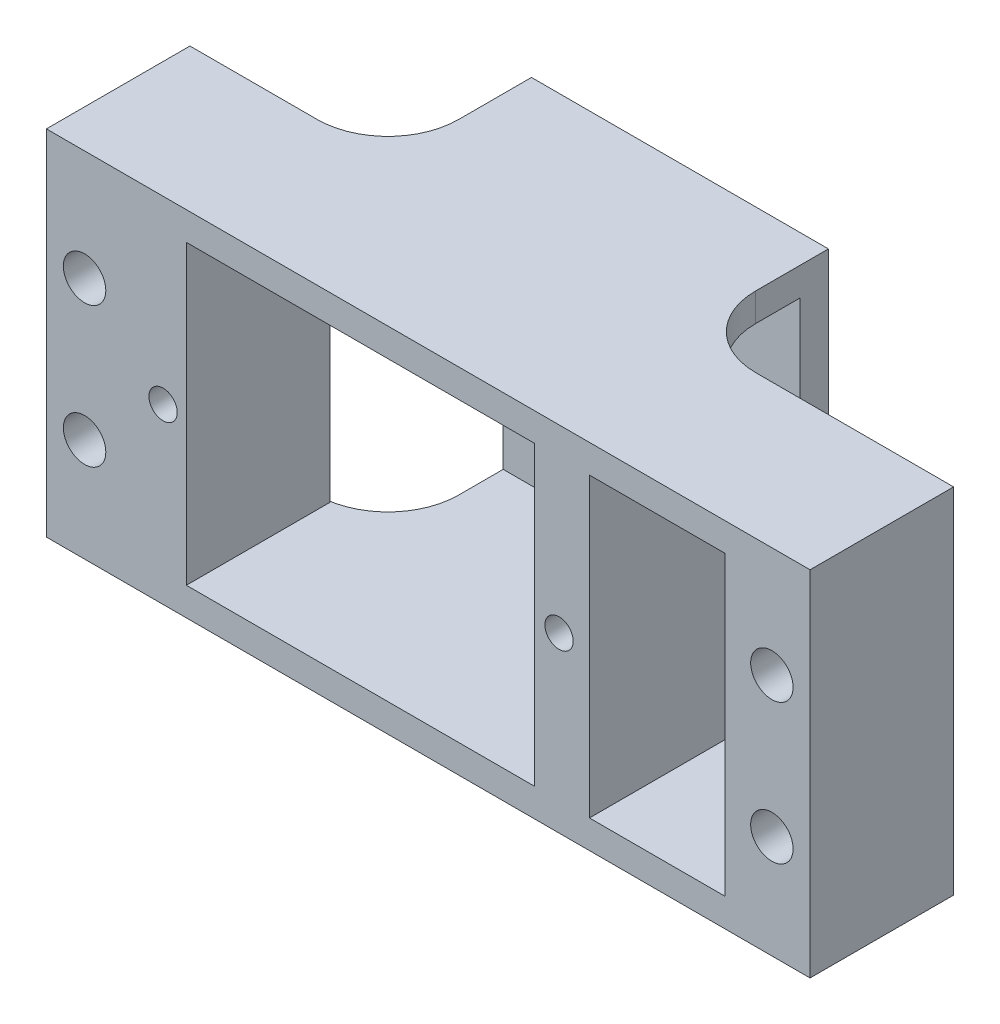
ISO-10303-21;
HEADER;
FILE_DESCRIPTION(('STEP AP214'),'2;1');
FILE_NAME('part.step','',(''),(''),'','','');
FILE_SCHEMA(('AUTOMOTIVE_DESIGN { 1 0 10303 214 1 1 1 1 }'));
ENDSEC;
DATA;
#1=APPLICATION_CONTEXT('core data for automotive mechanical design processes');
#2=APPLICATION_PROTOCOL_DEFINITION('international standard','automotive_design',2000,#1);
#3=PRODUCT_CONTEXT('',#1,'mechanical');
#4=PRODUCT('Part','Part','',(#3));
#5=PRODUCT_RELATED_PRODUCT_CATEGORY('part','',(#4));
#6=PRODUCT_DEFINITION_FORMATION('','',#4);
#7=PRODUCT_DEFINITION_CONTEXT('part definition',#1,'design');
#8=PRODUCT_DEFINITION('design','',#6,#7);
#9=PRODUCT_DEFINITION_SHAPE('','',#8);
#10=(LENGTH_UNIT() NAMED_UNIT(*) SI_UNIT(.MILLI.,.METRE.));
#11=(NAMED_UNIT(*) PLANE_ANGLE_UNIT() SI_UNIT($,.RADIAN.));
#12=(NAMED_UNIT(*) SI_UNIT($,.STERADIAN.) SOLID_ANGLE_UNIT());
#13=UNCERTAINTY_MEASURE_WITH_UNIT(LENGTH_MEASURE(1.E-05),#10,'distance_accuracy_value','');
#14=(GEOMETRIC_REPRESENTATION_CONTEXT(3) GLOBAL_UNCERTAINTY_ASSIGNED_CONTEXT((#13)) GLOBAL_UNIT_ASSIGNED_CONTEXT((#10,
#11,#12)) REPRESENTATION_CONTEXT('',''));
#15=CARTESIAN_POINT('',(0.,0.,0.));
#16=DIRECTION('',(0.,0.,1.));
#17=DIRECTION('',(1.,0.,0.));
#18=AXIS2_PLACEMENT_3D('',#15,#16,#17);
#19=CARTESIAN_POINT('',(0.,24.7347891742103,0.));
#20=DIRECTION('',(0.,1.,0.));
#21=DIRECTION('',(-1.,0.,0.));
#22=AXIS2_PLACEMENT_3D('',#19,#20,#21);
#23=PLANE('',#22);
#24=DIRECTION('',(0.,0.,1.));
#25=VECTOR('',#24,1.);
#26=CARTESIAN_POINT('',(5.58147525819313,24.7347891742103,0.));
#27=LINE('',#26,#25);
#28=CARTESIAN_POINT('',(5.58147525819313,24.7347891742103,-6.66606634156076));
#29=VERTEX_POINT('',#28);
#30=CARTESIAN_POINT('',(5.58147525819313,24.7347891742103,-1.51606634156077));
#31=VERTEX_POINT('',#30);
#32=EDGE_CURVE('E262',#29,#31,#27,.T.);
#33=ORIENTED_EDGE('',*,*,#32,.F.);
#34=DIRECTION('',(1.,0.,0.));
#35=VECTOR('',#34,1.);
#36=CARTESIAN_POINT('',(5.58147525819313,24.7347891742103,-6.66606634156076));
#37=LINE('',#36,#35);
#38=CARTESIAN_POINT('',(-15.4185247418069,24.7347891742103,-6.66606634156076));
#39=VERTEX_POINT('',#38);
#40=EDGE_CURVE('E249',#39,#29,#37,.T.);
#41=ORIENTED_EDGE('',*,*,#40,.F.);
#42=DIRECTION('',(0.,0.,-1.));
#43=VECTOR('',#42,1.);
#44=CARTESIAN_POINT('',(-15.4185247418069,24.7347891742103,0.));
#45=LINE('',#44,#43);
#46=CARTESIAN_POINT('',(-15.4185247418069,24.7347891742103,-1.51606634156077));
#47=VERTEX_POINT('',#46);
#48=EDGE_CURVE('E260',#47,#39,#45,.T.);
#49=ORIENTED_EDGE('',*,*,#48,.F.);
#50=CARTESIAN_POINT('',(-20.4185247418069,24.7347891742103,-1.51606634156077));
#51=DIRECTION('',(0.,1.,0.));
#52=DIRECTION('',(-1.,0.,0.));
#53=AXIS2_PLACEMENT_3D('',#50,#51,#52);
#54=CIRCLE('',#53,5.);
#55=CARTESIAN_POINT('',(-20.4185247418069,24.7347891742103,3.48393365843923));
#56=VERTEX_POINT('',#55);
#57=EDGE_CURVE('E400',#47,#56,#54,.F.);
#58=ORIENTED_EDGE('',*,*,#57,.T.);
#59=DIRECTION('',(1.,0.,0.));
#60=VECTOR('',#59,1.);
#61=CARTESIAN_POINT('',(0.,24.7347891742103,3.48393365843923));
#62=LINE('',#61,#60);
#63=CARTESIAN_POINT('',(-29.4185247418069,24.7347891742103,3.48393365843923));
#64=VERTEX_POINT('',#63);
#65=EDGE_CURVE('E313',#64,#56,#62,.T.);
#66=ORIENTED_EDGE('',*,*,#65,.F.);
#67=DIRECTION('',(0.,0.,1.));
#68=VECTOR('',#67,1.);
#69=CARTESIAN_POINT('',(-29.4185247418069,24.7347891742103,0.));
#70=LINE('',#69,#68);
#71=CARTESIAN_POINT('',(-29.4185247418069,24.7347891742103,13.6339336584392));
#72=VERTEX_POINT('',#71);
#73=EDGE_CURVE('E302',#64,#72,#70,.T.);
#74=ORIENTED_EDGE('',*,*,#73,.T.);
#75=DIRECTION('',(1.,0.,0.));
#76=VECTOR('',#75,1.);
#77=CARTESIAN_POINT('',(0.,24.7347891742103,13.6339336584392));
#78=LINE('',#77,#76);
#79=CARTESIAN_POINT('',(24.5814752581931,24.7347891742103,13.6339336584392));
#80=VERTEX_POINT('',#79);
#81=EDGE_CURVE('E305',#72,#80,#78,.T.);
#82=ORIENTED_EDGE('',*,*,#81,.T.);
#83=DIRECTION('',(0.,0.,-1.));
#84=VECTOR('',#83,1.);
#85=CARTESIAN_POINT('',(24.5814752581931,24.7347891742103,0.));
#86=LINE('',#85,#84);
#87=CARTESIAN_POINT('',(24.5814752581931,24.7347891742103,3.48393365843923));
#88=VERTEX_POINT('',#87);
#89=EDGE_CURVE('E308',#80,#88,#86,.T.);
#90=ORIENTED_EDGE('',*,*,#89,.T.);
#91=CARTESIAN_POINT('',(10.5814752581931,24.7347891742103,3.48393365843923));
#92=VERTEX_POINT('',#91);
#93=EDGE_CURVE('E311',#92,#88,#62,.T.);
#94=ORIENTED_EDGE('',*,*,#93,.F.);
#95=CARTESIAN_POINT('',(10.5814752581931,24.7347891742103,-1.51606634156077));
#96=DIRECTION('',(0.,1.,0.));
#97=DIRECTION('',(-1.,0.,0.));
#98=AXIS2_PLACEMENT_3D('',#95,#96,#97);
#99=CIRCLE('',#98,5.);
#100=EDGE_CURVE('E393',#92,#31,#99,.F.);
#101=ORIENTED_EDGE('',*,*,#100,.T.);
#102=EDGE_LOOP('',(#33,#41,#49,#58,#66,#74,#82,#90,#94,#101));
#103=FACE_BOUND('',#102,.T.);
#104=ADVANCED_FACE('F83',(#103),#23,.T.);
#105=CARTESIAN_POINT('',(5.58147525819313,-0.265210825789664,0.));
#106=DIRECTION('',(1.,0.,0.));
#107=DIRECTION('',(0.,0.,-1.));
#108=AXIS2_PLACEMENT_3D('',#105,#106,#107);
#109=PLANE('',#108);
#110=DIRECTION('',(0.,-1.,0.));
#111=VECTOR('',#110,1.);
#112=CARTESIAN_POINT('',(5.58147525819314,0.,-6.66606634156078));
#113=LINE('',#112,#111);
#114=CARTESIAN_POINT('',(5.58147525819313,-0.265210825789663,-6.66606634156076));
#115=VERTEX_POINT('',#114);
#116=EDGE_CURVE('E467',#29,#115,#113,.T.);
#117=ORIENTED_EDGE('',*,*,#116,.F.);
#118=ORIENTED_EDGE('',*,*,#32,.T.);
#119=DIRECTION('',(0.,-1.,0.));
#120=VECTOR('',#119,1.);
#121=CARTESIAN_POINT('',(5.58147525819313,-0.265210825789664,-1.51606634156077));
#122=LINE('',#121,#120);
#123=CARTESIAN_POINT('',(5.58147525819313,22.7347891742103,-1.51606634156077));
#124=VERTEX_POINT('',#123);
#125=EDGE_CURVE('E372',#31,#124,#122,.T.);
#126=ORIENTED_EDGE('',*,*,#125,.T.);
#127=DIRECTION('',(0.,0.,1.));
#128=VECTOR('',#127,1.);
#129=CARTESIAN_POINT('',(5.58147525819313,22.7347891742103,0.));
#130=LINE('',#129,#128);
#131=CARTESIAN_POINT('',(5.58147525819314,22.7347891742103,-4.66606634156077));
#132=VERTEX_POINT('',#131);
#133=EDGE_CURVE('E306',#132,#124,#130,.T.);
#134=ORIENTED_EDGE('',*,*,#133,.F.);
#135=DIRECTION('',(0.,1.,0.));
#136=VECTOR('',#135,1.);
#137=CARTESIAN_POINT('',(5.58147525819314,0.,-4.66606634156077));
#138=LINE('',#137,#136);
#139=CARTESIAN_POINT('',(5.58147525819314,1.73478917421034,-4.66606634156077));
#140=VERTEX_POINT('',#139);
#141=EDGE_CURVE('E255',#140,#132,#138,.T.);
#142=ORIENTED_EDGE('',*,*,#141,.F.);
#143=DIRECTION('',(0.,0.,-1.));
#144=VECTOR('',#143,1.);
#145=CARTESIAN_POINT('',(5.58147525819313,1.73478917421034,0.));
#146=LINE('',#145,#144);
#147=CARTESIAN_POINT('',(5.58147525819313,1.73478917421034,-1.51606634156077));
#148=VERTEX_POINT('',#147);
#149=EDGE_CURVE('E348',#148,#140,#146,.T.);
#150=ORIENTED_EDGE('',*,*,#149,.F.);
#151=DIRECTION('',(0.,1.,0.));
#152=VECTOR('',#151,1.);
#153=CARTESIAN_POINT('',(5.58147525819313,-0.265210825789664,-1.51606634156077));
#154=LINE('',#153,#152);
#155=CARTESIAN_POINT('',(5.58147525819313,-0.265210825789664,-1.51606634156077));
#156=VERTEX_POINT('',#155);
#157=EDGE_CURVE('E375',#148,#156,#154,.F.);
#158=ORIENTED_EDGE('',*,*,#157,.T.);
#159=DIRECTION('',(0.,0.,-1.));
#160=VECTOR('',#159,1.);
#161=CARTESIAN_POINT('',(5.58147525819313,-0.265210825789664,0.));
#162=LINE('',#161,#160);
#163=EDGE_CURVE('E339',#156,#115,#162,.T.);
#164=ORIENTED_EDGE('',*,*,#163,.T.);
#165=EDGE_LOOP('',(#117,#118,#126,#134,#142,#150,#158,#164));
#166=FACE_BOUND('',#165,.T.);
#167=ADVANCED_FACE('F489',(#166),#109,.T.);
#168=CARTESIAN_POINT('',(-15.4185247418069,0.,0.));
#169=DIRECTION('',(-1.,0.,0.));
#170=DIRECTION('',(0.,0.,1.));
#171=AXIS2_PLACEMENT_3D('',#168,#169,#170);
#172=PLANE('',#171);
#173=ORIENTED_EDGE('',*,*,#48,.T.);
#174=DIRECTION('',(0.,-1.,0.));
#175=VECTOR('',#174,1.);
#176=CARTESIAN_POINT('',(-15.4185247418069,0.,-6.66606634156078));
#177=LINE('',#176,#175);
#178=CARTESIAN_POINT('',(-15.4185247418069,-0.265210825789663,-6.66606634156076));
#179=VERTEX_POINT('',#178);
#180=EDGE_CURVE('E246',#39,#179,#177,.T.);
#181=ORIENTED_EDGE('',*,*,#180,.T.);
#182=DIRECTION('',(0.,0.,1.));
#183=VECTOR('',#182,1.);
#184=CARTESIAN_POINT('',(-15.4185247418069,-0.265210825789663,0.));
#185=LINE('',#184,#183);
#186=CARTESIAN_POINT('',(-15.4185247418069,-0.265210825789663,-1.51606634156077));
#187=VERTEX_POINT('',#186);
#188=EDGE_CURVE('E269',#179,#187,#185,.T.);
#189=ORIENTED_EDGE('',*,*,#188,.T.);
#190=DIRECTION('',(0.,1.,0.));
#191=VECTOR('',#190,1.);
#192=CARTESIAN_POINT('',(-15.4185247418069,0.,-1.51606634156077));
#193=LINE('',#192,#191);
#194=CARTESIAN_POINT('',(-15.4185247418069,1.73478917421034,-1.51606634156077));
#195=VERTEX_POINT('',#194);
#196=EDGE_CURVE('E378',#187,#195,#193,.T.);
#197=ORIENTED_EDGE('',*,*,#196,.T.);
#198=DIRECTION('',(0.,0.,-1.));
#199=VECTOR('',#198,1.);
#200=CARTESIAN_POINT('',(-15.4185247418069,1.73478917421034,0.));
#201=LINE('',#200,#199);
#202=CARTESIAN_POINT('',(-15.4185247418069,1.73478917421034,-4.66606634156077));
#203=VERTEX_POINT('',#202);
#204=EDGE_CURVE('E274',#195,#203,#201,.T.);
#205=ORIENTED_EDGE('',*,*,#204,.T.);
#206=DIRECTION('',(0.,1.,0.));
#207=VECTOR('',#206,1.);
#208=CARTESIAN_POINT('',(-15.4185247418069,0.,-4.66606634156077));
#209=LINE('',#208,#207);
#210=CARTESIAN_POINT('',(-15.4185247418069,22.7347891742103,-4.66606634156077));
#211=VERTEX_POINT('',#210);
#212=EDGE_CURVE('E100',#203,#211,#209,.T.);
#213=ORIENTED_EDGE('',*,*,#212,.T.);
#214=DIRECTION('',(0.,0.,1.));
#215=VECTOR('',#214,1.);
#216=CARTESIAN_POINT('',(-15.4185247418069,22.7347891742103,0.));
#217=LINE('',#216,#215);
#218=CARTESIAN_POINT('',(-15.4185247418069,22.7347891742103,-1.51606634156077));
#219=VERTEX_POINT('',#218);
#220=EDGE_CURVE('E270',#211,#219,#217,.T.);
#221=ORIENTED_EDGE('',*,*,#220,.T.);
#222=DIRECTION('',(0.,1.,0.));
#223=VECTOR('',#222,1.);
#224=CARTESIAN_POINT('',(-15.4185247418069,0.,-1.51606634156077));
#225=LINE('',#224,#223);
#226=EDGE_CURVE('E268',#219,#47,#225,.T.);
#227=ORIENTED_EDGE('',*,*,#226,.T.);
#228=EDGE_LOOP('',(#173,#181,#189,#197,#205,#213,#221,#227));
#229=FACE_BOUND('',#228,.T.);
#230=ADVANCED_FACE('F266',(#229),#172,.T.);
#231=CARTESIAN_POINT('',(-12.6185247418069,11.9847891742103,56.3339336584393));
#232=DIRECTION('',(0.,0.,-1.));
#233=DIRECTION('',(-1.,0.,0.));
#234=AXIS2_PLACEMENT_3D('',#231,#232,#233);
#235=CYLINDRICAL_SURFACE('',#234,1.);
#236=CARTESIAN_POINT('',(-12.6185247418069,11.9847891742103,-6.66606634156078));
#237=DIRECTION('',(0.,0.,-1.));
#238=DIRECTION('',(-1.,0.,0.));
#239=AXIS2_PLACEMENT_3D('',#236,#237,#238);
#240=CIRCLE('',#239,1.);
#241=CARTESIAN_POINT('',(-13.6185247418069,11.9847891742103,-6.66606634156078));
#242=VERTEX_POINT('',#241);
#243=EDGE_CURVE('E12',#242,#242,#240,.F.);
#244=ORIENTED_EDGE('',*,*,#243,.F.);
#245=EDGE_LOOP('',(#244));
#246=FACE_BOUND('',#245,.T.);
#247=CARTESIAN_POINT('',(-12.6185247418069,11.9847891742103,-7.96606634156076));
#248=DIRECTION('',(0.,0.,-1.));
#249=DIRECTION('',(-1.,0.,0.));
#250=AXIS2_PLACEMENT_3D('',#247,#248,#249);
#251=CIRCLE('',#250,1.);
#252=CARTESIAN_POINT('',(-13.6185247418069,11.9847891742103,-7.96606634156076));
#253=VERTEX_POINT('',#252);
#254=EDGE_CURVE('E263',#253,#253,#251,.F.);
#255=ORIENTED_EDGE('',*,*,#254,.T.);
#256=EDGE_LOOP('',(#255));
#257=FACE_BOUND('',#256,.T.);
#258=ADVANCED_FACE('F477',(#246,#257),#235,.T.);
#259=CARTESIAN_POINT('',(0.,-0.265210825789663,0.));
#260=DIRECTION('',(0.,-1.,0.));
#261=DIRECTION('',(1.,0.,0.));
#262=AXIS2_PLACEMENT_3D('',#259,#260,#261);
#263=PLANE('',#262);
#264=DIRECTION('',(-1.,0.,0.));
#265=VECTOR('',#264,1.);
#266=CARTESIAN_POINT('',(-15.4185247418069,-0.265210825789663,-6.66606634156076));
#267=LINE('',#266,#265);
#268=EDGE_CURVE('E252',#115,#179,#267,.T.);
#269=ORIENTED_EDGE('',*,*,#268,.F.);
#270=ORIENTED_EDGE('',*,*,#163,.F.);
#271=CARTESIAN_POINT('',(10.5814752581931,-0.265210825789664,-1.51606634156077));
#272=DIRECTION('',(0.,-1.,0.));
#273=DIRECTION('',(1.,0.,0.));
#274=AXIS2_PLACEMENT_3D('',#271,#272,#273);
#275=CIRCLE('',#274,5.);
#276=CARTESIAN_POINT('',(10.5814752581931,-0.265210825789664,3.48393365843923));
#277=VERTEX_POINT('',#276);
#278=EDGE_CURVE('E389',#156,#277,#275,.F.);
#279=ORIENTED_EDGE('',*,*,#278,.T.);
#280=DIRECTION('',(1.,0.,0.));
#281=VECTOR('',#280,1.);
#282=CARTESIAN_POINT('',(0.,-0.265210825789663,3.48393365843923));
#283=LINE('',#282,#281);
#284=CARTESIAN_POINT('',(24.5814752581931,-0.265210825789664,3.48393365843923));
#285=VERTEX_POINT('',#284);
#286=EDGE_CURVE('E342',#277,#285,#283,.T.);
#287=ORIENTED_EDGE('',*,*,#286,.T.);
#288=DIRECTION('',(0.,0.,-1.));
#289=VECTOR('',#288,1.);
#290=CARTESIAN_POINT('',(24.5814752581931,-0.265210825789664,13.6339336584392));
#291=LINE('',#290,#289);
#292=CARTESIAN_POINT('',(24.5814752581931,-0.265210825789664,13.6339336584392));
#293=VERTEX_POINT('',#292);
#294=EDGE_CURVE('E333',#293,#285,#291,.T.);
#295=ORIENTED_EDGE('',*,*,#294,.F.);
#296=DIRECTION('',(-1.,0.,0.));
#297=VECTOR('',#296,1.);
#298=CARTESIAN_POINT('',(0.,-0.265210825789663,13.6339336584392));
#299=LINE('',#298,#297);
#300=CARTESIAN_POINT('',(-29.4185247418069,-0.265210825789662,13.6339336584392));
#301=VERTEX_POINT('',#300);
#302=EDGE_CURVE('E334',#293,#301,#299,.T.);
#303=ORIENTED_EDGE('',*,*,#302,.T.);
#304=DIRECTION('',(0.,0.,-1.));
#305=VECTOR('',#304,1.);
#306=CARTESIAN_POINT('',(-29.4185247418069,-0.265210825789662,13.6339336584392));
#307=LINE('',#306,#305);
#308=CARTESIAN_POINT('',(-29.4185247418069,-0.265210825789662,3.48393365843923));
#309=VERTEX_POINT('',#308);
#310=EDGE_CURVE('E353',#301,#309,#307,.T.);
#311=ORIENTED_EDGE('',*,*,#310,.T.);
#312=DIRECTION('',(1.,0.,0.));
#313=VECTOR('',#312,1.);
#314=CARTESIAN_POINT('',(0.,-0.265210825789663,3.48393365843923));
#315=LINE('',#314,#313);
#316=CARTESIAN_POINT('',(-20.4185247418069,-0.265210825789663,3.48393365843923));
#317=VERTEX_POINT('',#316);
#318=EDGE_CURVE('E336',#309,#317,#315,.T.);
#319=ORIENTED_EDGE('',*,*,#318,.T.);
#320=CARTESIAN_POINT('',(-20.4185247418069,-0.265210825789662,-1.51606634156077));
#321=DIRECTION('',(0.,-1.,0.));
#322=DIRECTION('',(1.,0.,0.));
#323=AXIS2_PLACEMENT_3D('',#320,#321,#322);
#324=CIRCLE('',#323,5.);
#325=EDGE_CURVE('E397',#317,#187,#324,.F.);
#326=ORIENTED_EDGE('',*,*,#325,.T.);
#327=ORIENTED_EDGE('',*,*,#188,.F.);
#328=EDGE_LOOP('',(#269,#270,#279,#287,#295,#303,#311,#319,#326,#327));
#329=FACE_BOUND('',#328,.T.);
#330=ADVANCED_FACE('F511',(#329),#263,.T.);
#331=CARTESIAN_POINT('',(0.,1.73478917421034,0.));
#332=DIRECTION('',(0.,-1.,0.));
#333=DIRECTION('',(1.,0.,0.));
#334=AXIS2_PLACEMENT_3D('',#331,#332,#333);
#335=PLANE('',#334);
#336=ORIENTED_EDGE('',*,*,#149,.T.);
#337=DIRECTION('',(-1.,0.,0.));
#338=VECTOR('',#337,1.);
#339=CARTESIAN_POINT('',(5.58147525819314,1.73478917421034,-4.66606634156077));
#340=LINE('',#339,#338);
#341=EDGE_CURVE('E463',#140,#203,#340,.T.);
#342=ORIENTED_EDGE('',*,*,#341,.T.);
#343=ORIENTED_EDGE('',*,*,#204,.F.);
#344=CARTESIAN_POINT('',(-20.4185247418069,1.73478917421034,-1.51606634156077));
#345=DIRECTION('',(0.,-1.,0.));
#346=DIRECTION('',(1.,0.,0.));
#347=AXIS2_PLACEMENT_3D('',#344,#345,#346);
#348=CIRCLE('',#347,5.);
#349=CARTESIAN_POINT('',(-20.4185247418069,1.73478917421034,3.48393365843923));
#350=VERTEX_POINT('',#349);
#351=EDGE_CURVE('E395',#195,#350,#348,.T.);
#352=ORIENTED_EDGE('',*,*,#351,.T.);
#353=DIRECTION('',(-1.,0.,0.));
#354=VECTOR('',#353,1.);
#355=CARTESIAN_POINT('',(0.,1.73478917421034,3.48393365843923));
#356=LINE('',#355,#354);
#357=CARTESIAN_POINT('',(-19.5212474862921,1.73478917421034,3.48393365843923));
#358=VERTEX_POINT('',#357);
#359=EDGE_CURVE('E451',#358,#350,#356,.T.);
#360=ORIENTED_EDGE('',*,*,#359,.F.);
#361=DIRECTION('',(0.,0.,-1.));
#362=VECTOR('',#361,1.);
#363=CARTESIAN_POINT('',(-19.5212474862921,1.73478917421034,0.));
#364=LINE('',#363,#362);
#365=CARTESIAN_POINT('',(-19.5212474862921,1.73478917421034,13.6339336584392));
#366=VERTEX_POINT('',#365);
#367=EDGE_CURVE('E457',#366,#358,#364,.T.);
#368=ORIENTED_EDGE('',*,*,#367,.F.);
#369=DIRECTION('',(-1.,0.,0.));
#370=VECTOR('',#369,1.);
#371=CARTESIAN_POINT('',(0.,1.73478917421034,13.6339336584392));
#372=LINE('',#371,#370);
#373=CARTESIAN_POINT('',(5.08363136507819,1.73478917421034,13.6339336584392));
#374=VERTEX_POINT('',#373);
#375=EDGE_CURVE('E349',#374,#366,#372,.T.);
#376=ORIENTED_EDGE('',*,*,#375,.F.);
#377=DIRECTION('',(0.,0.,1.));
#378=VECTOR('',#377,1.);
#379=CARTESIAN_POINT('',(5.08363136509057,1.73478917421034,0.));
#380=LINE('',#379,#378);
#381=CARTESIAN_POINT('',(5.08363136509057,1.73478917421034,3.48393365843923));
#382=VERTEX_POINT('',#381);
#383=EDGE_CURVE('E432',#382,#374,#380,.T.);
#384=ORIENTED_EDGE('',*,*,#383,.F.);
#385=DIRECTION('',(-1.,0.,0.));
#386=VECTOR('',#385,1.);
#387=CARTESIAN_POINT('',(0.,1.73478917421034,3.48393365843923));
#388=LINE('',#387,#386);
#389=CARTESIAN_POINT('',(8.98147525827101,1.73478917421034,3.48393365843923));
#390=VERTEX_POINT('',#389);
#391=EDGE_CURVE('E108',#390,#382,#388,.T.);
#392=ORIENTED_EDGE('',*,*,#391,.F.);
#393=DIRECTION('',(0.,0.,-1.));
#394=VECTOR('',#393,1.);
#395=CARTESIAN_POINT('',(8.98147525822371,1.73478917421034,0.));
#396=LINE('',#395,#394);
#397=CARTESIAN_POINT('',(8.98147525821133,1.73478917421034,13.6339336584392));
#398=VERTEX_POINT('',#397);
#399=EDGE_CURVE('E438',#398,#390,#396,.T.);
#400=ORIENTED_EDGE('',*,*,#399,.F.);
#401=CARTESIAN_POINT('',(18.5814752581931,1.73478917421034,13.6339336584392));
#402=VERTEX_POINT('',#401);
#403=EDGE_CURVE('E345',#402,#398,#372,.T.);
#404=ORIENTED_EDGE('',*,*,#403,.F.);
#405=DIRECTION('',(0.,0.,1.));
#406=VECTOR('',#405,1.);
#407=CARTESIAN_POINT('',(18.5814752581931,1.73478917421034,0.));
#408=LINE('',#407,#406);
#409=CARTESIAN_POINT('',(18.5814752581931,1.73478917421034,3.48393365843923));
#410=VERTEX_POINT('',#409);
#411=EDGE_CURVE('E325',#410,#402,#408,.T.);
#412=ORIENTED_EDGE('',*,*,#411,.F.);
#413=DIRECTION('',(1.,0.,0.));
#414=VECTOR('',#413,1.);
#415=CARTESIAN_POINT('',(0.,1.73478917421034,3.48393365843923));
#416=LINE('',#415,#414);
#417=CARTESIAN_POINT('',(10.5814752581931,1.73478917421034,3.48393365843923));
#418=VERTEX_POINT('',#417);
#419=EDGE_CURVE('E337',#418,#410,#416,.T.);
#420=ORIENTED_EDGE('',*,*,#419,.F.);
#421=CARTESIAN_POINT('',(10.5814752581931,1.73478917421034,-1.51606634156077));
#422=DIRECTION('',(0.,-1.,0.));
#423=DIRECTION('',(1.,0.,0.));
#424=AXIS2_PLACEMENT_3D('',#421,#422,#423);
#425=CIRCLE('',#424,5.);
#426=EDGE_CURVE('E387',#418,#148,#425,.T.);
#427=ORIENTED_EDGE('',*,*,#426,.T.);
#428=EDGE_LOOP('',(#336,#342,#343,#352,#360,#368,#376,#384,#392,#400,#404,#412,#420,#427));
#429=FACE_BOUND('',#428,.T.);
#430=ADVANCED_FACE('F461',(#429),#335,.F.);
#431=CARTESIAN_POINT('',(0.,22.7347891742103,0.));
#432=DIRECTION('',(0.,1.,0.));
#433=DIRECTION('',(-1.,0.,0.));
#434=AXIS2_PLACEMENT_3D('',#431,#432,#433);
#435=PLANE('',#434);
#436=ORIENTED_EDGE('',*,*,#220,.F.);
#437=DIRECTION('',(-1.,0.,0.));
#438=VECTOR('',#437,1.);
#439=CARTESIAN_POINT('',(5.58147525819314,22.7347891742103,-4.66606634156077));
#440=LINE('',#439,#438);
#441=EDGE_CURVE('E416',#132,#211,#440,.T.);
#442=ORIENTED_EDGE('',*,*,#441,.F.);
#443=ORIENTED_EDGE('',*,*,#133,.T.);
#444=CARTESIAN_POINT('',(10.5814752581931,22.7347891742103,-1.51606634156077));
#445=DIRECTION('',(0.,1.,0.));
#446=DIRECTION('',(-1.,0.,0.));
#447=AXIS2_PLACEMENT_3D('',#444,#445,#446);
#448=CIRCLE('',#447,5.);
#449=CARTESIAN_POINT('',(10.5814752581931,22.7347891742103,3.48393365843923));
#450=VERTEX_POINT('',#449);
#451=EDGE_CURVE('E391',#124,#450,#448,.T.);
#452=ORIENTED_EDGE('',*,*,#451,.T.);
#453=DIRECTION('',(1.,0.,0.));
#454=VECTOR('',#453,1.);
#455=CARTESIAN_POINT('',(0.,22.7347891742103,3.48393365843923));
#456=LINE('',#455,#454);
#457=CARTESIAN_POINT('',(18.5814752581931,22.7347891742103,3.48393365843923));
#458=VERTEX_POINT('',#457);
#459=EDGE_CURVE('E318',#450,#458,#456,.T.);
#460=ORIENTED_EDGE('',*,*,#459,.T.);
#461=DIRECTION('',(0.,0.,1.));
#462=VECTOR('',#461,1.);
#463=CARTESIAN_POINT('',(18.5814752581931,22.7347891742103,0.));
#464=LINE('',#463,#462);
#465=CARTESIAN_POINT('',(18.5814752581931,22.7347891742103,13.6339336584392));
#466=VERTEX_POINT('',#465);
#467=EDGE_CURVE('E321',#458,#466,#464,.T.);
#468=ORIENTED_EDGE('',*,*,#467,.T.);
#469=DIRECTION('',(1.,0.,0.));
#470=VECTOR('',#469,1.);
#471=CARTESIAN_POINT('',(0.,22.7347891742103,13.6339336584392));
#472=LINE('',#471,#470);
#473=CARTESIAN_POINT('',(8.98147525821133,22.7347891742103,13.6339336584392));
#474=VERTEX_POINT('',#473);
#475=EDGE_CURVE('E301',#474,#466,#472,.T.);
#476=ORIENTED_EDGE('',*,*,#475,.F.);
#477=DIRECTION('',(0.,0.,1.));
#478=VECTOR('',#477,1.);
#479=CARTESIAN_POINT('',(8.98147525816104,22.7347891742103,0.));
#480=LINE('',#479,#478);
#481=CARTESIAN_POINT('',(8.98147525816104,22.7347891742103,3.48393365843923));
#482=VERTEX_POINT('',#481);
#483=EDGE_CURVE('E435',#482,#474,#480,.T.);
#484=ORIENTED_EDGE('',*,*,#483,.F.);
#485=DIRECTION('',(1.,0.,0.));
#486=VECTOR('',#485,1.);
#487=CARTESIAN_POINT('',(0.,22.7347891742103,3.48393365843923));
#488=LINE('',#487,#486);
#489=CARTESIAN_POINT('',(5.0836313650185,22.7347891742103,3.48393365843923));
#490=VERTEX_POINT('',#489);
#491=EDGE_CURVE('E440',#490,#482,#488,.T.);
#492=ORIENTED_EDGE('',*,*,#491,.F.);
#493=DIRECTION('',(0.,0.,-1.));
#494=VECTOR('',#493,1.);
#495=CARTESIAN_POINT('',(5.0836313650279,22.7347891742103,0.));
#496=LINE('',#495,#494);
#497=CARTESIAN_POINT('',(5.08363136507819,22.7347891742103,13.6339336584392));
#498=VERTEX_POINT('',#497);
#499=EDGE_CURVE('E429',#498,#490,#496,.T.);
#500=ORIENTED_EDGE('',*,*,#499,.F.);
#501=CARTESIAN_POINT('',(-19.5212474862448,22.7347891742103,13.6339336584392));
#502=VERTEX_POINT('',#501);
#503=EDGE_CURVE('E315',#502,#498,#472,.T.);
#504=ORIENTED_EDGE('',*,*,#503,.F.);
#505=DIRECTION('',(0.,0.,1.));
#506=VECTOR('',#505,1.);
#507=CARTESIAN_POINT('',(-19.5212474863548,22.7347891742103,0.));
#508=LINE('',#507,#506);
#509=CARTESIAN_POINT('',(-19.5212474863548,22.7347891742103,3.48393365843923));
#510=VERTEX_POINT('',#509);
#511=EDGE_CURVE('E454',#510,#502,#508,.T.);
#512=ORIENTED_EDGE('',*,*,#511,.F.);
#513=DIRECTION('',(1.,0.,0.));
#514=VECTOR('',#513,1.);
#515=CARTESIAN_POINT('',(0.,22.7347891742103,3.48393365843923));
#516=LINE('',#515,#514);
#517=CARTESIAN_POINT('',(-20.4185247418069,22.7347891742103,3.48393365843923));
#518=VERTEX_POINT('',#517);
#519=EDGE_CURVE('E449',#518,#510,#516,.T.);
#520=ORIENTED_EDGE('',*,*,#519,.F.);
#521=CARTESIAN_POINT('',(-20.4185247418069,22.7347891742103,-1.51606634156077));
#522=DIRECTION('',(0.,1.,0.));
#523=DIRECTION('',(-1.,0.,0.));
#524=AXIS2_PLACEMENT_3D('',#521,#522,#523);
#525=CIRCLE('',#524,5.);
#526=EDGE_CURVE('E92',#518,#219,#525,.T.);
#527=ORIENTED_EDGE('',*,*,#526,.T.);
#528=EDGE_LOOP('',(#436,#442,#443,#452,#460,#468,#476,#484,#492,#500,#504,#512,#520,#527));
#529=FACE_BOUND('',#528,.T.);
#530=ADVANCED_FACE('F500',(#529),#435,.F.);
#531=CARTESIAN_POINT('',(-29.4185247418069,21.2347891742103,15.9339336584392));
#532=DIRECTION('',(1.,0.,0.));
#533=DIRECTION('',(0.,1.,0.));
#534=AXIS2_PLACEMENT_3D('',#531,#532,#533);
#535=PLANE('',#534);
#536=DIRECTION('',(0.,1.,0.));
#537=VECTOR('',#536,1.);
#538=CARTESIAN_POINT('',(-29.4185247418069,-0.265210825789662,13.6339336584392));
#539=LINE('',#538,#537);
#540=EDGE_CURVE('E359',#301,#72,#539,.T.);
#541=ORIENTED_EDGE('',*,*,#540,.T.);
#542=ORIENTED_EDGE('',*,*,#73,.F.);
#543=DIRECTION('',(0.,1.,0.));
#544=VECTOR('',#543,1.);
#545=CARTESIAN_POINT('',(-29.4185247418069,-0.265210825789662,3.48393365843923));
#546=LINE('',#545,#544);
#547=EDGE_CURVE('E356',#309,#64,#546,.T.);
#548=ORIENTED_EDGE('',*,*,#547,.F.);
#549=ORIENTED_EDGE('',*,*,#310,.F.);
#550=EDGE_LOOP('',(#541,#542,#548,#549));
#551=FACE_BOUND('',#550,.T.);
#552=ADVANCED_FACE('F503',(#551),#535,.F.);
#553=CARTESIAN_POINT('',(24.5814752581931,21.2347891742103,15.9339336584392));
#554=DIRECTION('',(-1.,0.,0.));
#555=DIRECTION('',(0.,-1.,0.));
#556=AXIS2_PLACEMENT_3D('',#553,#554,#555);
#557=PLANE('',#556);
#558=ORIENTED_EDGE('',*,*,#89,.F.);
#559=DIRECTION('',(0.,1.,0.));
#560=VECTOR('',#559,1.);
#561=CARTESIAN_POINT('',(24.5814752581931,-0.265210825789664,13.6339336584392));
#562=LINE('',#561,#560);
#563=EDGE_CURVE('E363',#293,#80,#562,.T.);
#564=ORIENTED_EDGE('',*,*,#563,.F.);
#565=ORIENTED_EDGE('',*,*,#294,.T.);
#566=DIRECTION('',(0.,1.,0.));
#567=VECTOR('',#566,1.);
#568=CARTESIAN_POINT('',(24.5814752581931,-0.265210825789664,3.48393365843923));
#569=LINE('',#568,#567);
#570=EDGE_CURVE('E357',#285,#88,#569,.T.);
#571=ORIENTED_EDGE('',*,*,#570,.T.);
#572=EDGE_LOOP('',(#558,#564,#565,#571));
#573=FACE_BOUND('',#572,.T.);
#574=ADVANCED_FACE('F527',(#573),#557,.F.);
#575=CARTESIAN_POINT('',(-2.41852474180687,11.9847891742103,13.6339336584392));
#576=DIRECTION('',(0.,0.,1.));
#577=DIRECTION('',(1.,0.,0.));
#578=AXIS2_PLACEMENT_3D('',#575,#576,#577);
#579=PLANE('',#578);
#580=DIRECTION('',(-2.98416846788996E-12,1.,0.));
#581=VECTOR('',#580,1.);
#582=CARTESIAN_POINT('',(-19.5212474862448,-14.1152108258103,13.6339336584392));
#583=LINE('',#582,#581);
#584=EDGE_CURVE('E444',#366,#502,#583,.T.);
#585=ORIENTED_EDGE('',*,*,#584,.T.);
#586=ORIENTED_EDGE('',*,*,#503,.T.);
#587=DIRECTION('',(-2.98416846788996E-12,1.,0.));
#588=VECTOR('',#587,1.);
#589=CARTESIAN_POINT('',(5.08363136513787,-14.1152108257368,13.6339336584392));
#590=LINE('',#589,#588);
#591=EDGE_CURVE('E425',#374,#498,#590,.T.);
#592=ORIENTED_EDGE('',*,*,#591,.F.);
#593=ORIENTED_EDGE('',*,*,#375,.T.);
#594=EDGE_LOOP('',(#585,#586,#592,#593));
#595=FACE_BOUND('',#594,.T.);
#596=ORIENTED_EDGE('',*,*,#563,.T.);
#597=ORIENTED_EDGE('',*,*,#81,.F.);
#598=ORIENTED_EDGE('',*,*,#540,.F.);
#599=ORIENTED_EDGE('',*,*,#302,.F.);
#600=EDGE_LOOP('',(#596,#597,#598,#599));
#601=FACE_BOUND('',#600,.T.);
#602=CARTESIAN_POINT('',(21.8814752581931,16.9347891742103,13.6339336584392));
#603=DIRECTION('',(0.,0.,1.));
#604=DIRECTION('',(1.,0.,0.));
#605=AXIS2_PLACEMENT_3D('',#602,#603,#604);
#606=CIRCLE('',#605,1.5);
#607=CARTESIAN_POINT('',(23.3814752581931,16.9347891742103,13.6339336584392));
#608=VERTEX_POINT('',#607);
#609=EDGE_CURVE('E280',#608,#608,#606,.T.);
#610=ORIENTED_EDGE('',*,*,#609,.F.);
#611=EDGE_LOOP('',(#610));
#612=FACE_BOUND('',#611,.T.);
#613=CARTESIAN_POINT('',(21.8814752581933,7.03478917421034,13.6339336584392));
#614=DIRECTION('',(0.,0.,1.));
#615=DIRECTION('',(1.,0.,0.));
#616=AXIS2_PLACEMENT_3D('',#613,#614,#615);
#617=CIRCLE('',#616,1.5);
#618=CARTESIAN_POINT('',(23.3814752581933,7.03478917421034,13.6339336584392));
#619=VERTEX_POINT('',#618);
#620=EDGE_CURVE('E272',#619,#619,#617,.T.);
#621=ORIENTED_EDGE('',*,*,#620,.F.);
#622=EDGE_LOOP('',(#621));
#623=FACE_BOUND('',#622,.T.);
#624=DIRECTION('',(-2.98416846788996E-12,1.,0.));
#625=VECTOR('',#624,1.);
#626=CARTESIAN_POINT('',(8.98147525827101,-14.1152108257252,13.6339336584392));
#627=LINE('',#626,#625);
#628=EDGE_CURVE('E427',#398,#474,#627,.T.);
#629=ORIENTED_EDGE('',*,*,#628,.T.);
#630=ORIENTED_EDGE('',*,*,#475,.T.);
#631=DIRECTION('',(0.,-1.,0.));
#632=VECTOR('',#631,1.);
#633=CARTESIAN_POINT('',(18.5814752581931,22.7347891742103,13.6339336584392));
#634=LINE('',#633,#632);
#635=EDGE_CURVE('E324',#466,#402,#634,.T.);
#636=ORIENTED_EDGE('',*,*,#635,.T.);
#637=ORIENTED_EDGE('',*,*,#403,.T.);
#638=EDGE_LOOP('',(#629,#630,#636,#637));
#639=FACE_BOUND('',#638,.T.);
#640=CARTESIAN_POINT('',(6.83147525819312,11.9847891742684,13.6339336584392));
#641=DIRECTION('',(0.,0.,1.));
#642=DIRECTION('',(1.,0.,0.));
#643=AXIS2_PLACEMENT_3D('',#640,#641,#642);
#644=CIRCLE('',#643,1.);
#645=CARTESIAN_POINT('',(7.83147525819312,11.9847891742684,13.6339336584392));
#646=VERTEX_POINT('',#645);
#647=EDGE_CURVE('E411',#646,#646,#644,.T.);
#648=ORIENTED_EDGE('',*,*,#647,.F.);
#649=EDGE_LOOP('',(#648));
#650=FACE_BOUND('',#649,.T.);
#651=CARTESIAN_POINT('',(-21.1685247418069,11.9847891741848,13.6339336584392));
#652=DIRECTION('',(0.,0.,1.));
#653=DIRECTION('',(1.,0.,0.));
#654=AXIS2_PLACEMENT_3D('',#651,#652,#653);
#655=CIRCLE('',#654,1.00000000000001);
#656=CARTESIAN_POINT('',(-20.1685247418069,11.9847891741848,13.6339336584392));
#657=VERTEX_POINT('',#656);
#658=EDGE_CURVE('E405',#657,#657,#655,.T.);
#659=ORIENTED_EDGE('',*,*,#658,.F.);
#660=EDGE_LOOP('',(#659));
#661=FACE_BOUND('',#660,.T.);
#662=CARTESIAN_POINT('',(-26.7185247418067,7.03478917421034,13.6339336584392));
#663=DIRECTION('',(0.,0.,1.));
#664=DIRECTION('',(1.,0.,0.));
#665=AXIS2_PLACEMENT_3D('',#662,#663,#664);
#666=CIRCLE('',#665,1.5);
#667=CARTESIAN_POINT('',(-25.2185247418067,7.03478917421034,13.6339336584392));
#668=VERTEX_POINT('',#667);
#669=EDGE_CURVE('E281',#668,#668,#666,.T.);
#670=ORIENTED_EDGE('',*,*,#669,.F.);
#671=EDGE_LOOP('',(#670));
#672=FACE_BOUND('',#671,.T.);
#673=CARTESIAN_POINT('',(-26.7185247418069,16.9347891742103,13.6339336584392));
#674=DIRECTION('',(0.,0.,1.));
#675=DIRECTION('',(1.,0.,0.));
#676=AXIS2_PLACEMENT_3D('',#673,#674,#675);
#677=CIRCLE('',#676,1.5);
#678=CARTESIAN_POINT('',(-25.2185247418069,16.9347891742103,13.6339336584392));
#679=VERTEX_POINT('',#678);
#680=EDGE_CURVE('E284',#679,#679,#677,.T.);
#681=ORIENTED_EDGE('',*,*,#680,.F.);
#682=EDGE_LOOP('',(#681));
#683=FACE_BOUND('',#682,.T.);
#684=ADVANCED_FACE('F523',(#595,#601,#612,#623,#639,#650,#661,#672,#683),#579,.T.);
#685=CARTESIAN_POINT('',(0.,-0.265210825789663,3.48393365843923));
#686=DIRECTION('',(0.,0.,1.));
#687=DIRECTION('',(1.,0.,0.));
#688=AXIS2_PLACEMENT_3D('',#685,#686,#687);
#689=PLANE('',#688);
#690=CARTESIAN_POINT('',(-21.1685247418069,11.9847891741848,3.48393365843923));
#691=DIRECTION('',(0.,0.,1.));
#692=DIRECTION('',(1.,0.,0.));
#693=AXIS2_PLACEMENT_3D('',#690,#691,#692);
#694=CIRCLE('',#693,1.00000000000001);
#695=CARTESIAN_POINT('',(-20.1685247418069,11.9847891741848,3.48393365843923));
#696=VERTEX_POINT('',#695);
#697=EDGE_CURVE('E87',#696,#696,#694,.T.);
#698=ORIENTED_EDGE('',*,*,#697,.T.);
#699=EDGE_LOOP('',(#698));
#700=FACE_BOUND('',#699,.T.);
#701=ORIENTED_EDGE('',*,*,#65,.T.);
#702=DIRECTION('',(0.,1.,0.));
#703=VECTOR('',#702,1.);
#704=CARTESIAN_POINT('',(-20.4185247418069,-0.265210825789662,3.48393365843923));
#705=LINE('',#704,#703);
#706=EDGE_CURVE('E381',#56,#518,#705,.F.);
#707=ORIENTED_EDGE('',*,*,#706,.T.);
#708=ORIENTED_EDGE('',*,*,#519,.T.);
#709=DIRECTION('',(-2.98416846788996E-12,1.,0.));
#710=VECTOR('',#709,1.);
#711=CARTESIAN_POINT('',(-19.5212474862448,-14.1152108258103,3.48393365843923));
#712=LINE('',#711,#710);
#713=EDGE_CURVE('E446',#358,#510,#712,.T.);
#714=ORIENTED_EDGE('',*,*,#713,.F.);
#715=ORIENTED_EDGE('',*,*,#359,.T.);
#716=DIRECTION('',(0.,1.,0.));
#717=VECTOR('',#716,1.);
#718=CARTESIAN_POINT('',(-20.4185247418069,-0.265210825789662,3.48393365843923));
#719=LINE('',#718,#717);
#720=EDGE_CURVE('E384',#350,#317,#719,.F.);
#721=ORIENTED_EDGE('',*,*,#720,.T.);
#722=ORIENTED_EDGE('',*,*,#318,.F.);
#723=ORIENTED_EDGE('',*,*,#547,.T.);
#724=EDGE_LOOP('',(#701,#707,#708,#714,#715,#721,#722,#723));
#725=FACE_BOUND('',#724,.T.);
#726=CARTESIAN_POINT('',(-26.7185247418069,16.9347891742103,3.48393365843923));
#727=DIRECTION('',(0.,0.,1.));
#728=DIRECTION('',(1.,0.,0.));
#729=AXIS2_PLACEMENT_3D('',#726,#727,#728);
#730=CIRCLE('',#729,1.5);
#731=CARTESIAN_POINT('',(-25.2185247418069,16.9347891742103,3.48393365843923));
#732=VERTEX_POINT('',#731);
#733=EDGE_CURVE('E295',#732,#732,#730,.T.);
#734=ORIENTED_EDGE('',*,*,#733,.T.);
#735=EDGE_LOOP('',(#734));
#736=FACE_BOUND('',#735,.T.);
#737=CARTESIAN_POINT('',(-26.7185247418067,7.03478917421034,3.48393365843923));
#738=DIRECTION('',(0.,0.,1.));
#739=DIRECTION('',(1.,0.,0.));
#740=AXIS2_PLACEMENT_3D('',#737,#738,#739);
#741=CIRCLE('',#740,1.5);
#742=CARTESIAN_POINT('',(-25.2185247418067,7.03478917421034,3.48393365843923));
#743=VERTEX_POINT('',#742);
#744=EDGE_CURVE('E298',#743,#743,#741,.T.);
#745=ORIENTED_EDGE('',*,*,#744,.T.);
#746=EDGE_LOOP('',(#745));
#747=FACE_BOUND('',#746,.T.);
#748=ADVANCED_FACE('F518',(#700,#725,#736,#747),#689,.F.);
#749=CARTESIAN_POINT('',(0.,-0.265210825789663,3.48393365843923));
#750=DIRECTION('',(0.,0.,1.));
#751=DIRECTION('',(1.,0.,0.));
#752=AXIS2_PLACEMENT_3D('',#749,#750,#751);
#753=PLANE('',#752);
#754=CARTESIAN_POINT('',(21.8814752581933,7.03478917421034,3.48393365843923));
#755=DIRECTION('',(0.,0.,1.));
#756=DIRECTION('',(1.,0.,0.));
#757=AXIS2_PLACEMENT_3D('',#754,#755,#756);
#758=CIRCLE('',#757,1.5);
#759=CARTESIAN_POINT('',(23.3814752581933,7.03478917421034,3.48393365843923));
#760=VERTEX_POINT('',#759);
#761=EDGE_CURVE('E292',#760,#760,#758,.T.);
#762=ORIENTED_EDGE('',*,*,#761,.T.);
#763=EDGE_LOOP('',(#762));
#764=FACE_BOUND('',#763,.T.);
#765=CARTESIAN_POINT('',(21.8814752581931,16.9347891742103,3.48393365843923));
#766=DIRECTION('',(0.,0.,1.));
#767=DIRECTION('',(1.,0.,0.));
#768=AXIS2_PLACEMENT_3D('',#765,#766,#767);
#769=CIRCLE('',#768,1.5);
#770=CARTESIAN_POINT('',(23.3814752581931,16.9347891742103,3.48393365843923));
#771=VERTEX_POINT('',#770);
#772=EDGE_CURVE('E289',#771,#771,#769,.T.);
#773=ORIENTED_EDGE('',*,*,#772,.T.);
#774=EDGE_LOOP('',(#773));
#775=FACE_BOUND('',#774,.T.);
#776=ORIENTED_EDGE('',*,*,#286,.F.);
#777=DIRECTION('',(0.,1.,0.));
#778=VECTOR('',#777,1.);
#779=CARTESIAN_POINT('',(10.5814752581931,-0.265210825789664,3.48393365843923));
#780=LINE('',#779,#778);
#781=EDGE_CURVE('E369',#277,#418,#780,.T.);
#782=ORIENTED_EDGE('',*,*,#781,.T.);
#783=ORIENTED_EDGE('',*,*,#419,.T.);
#784=DIRECTION('',(0.,-1.,0.));
#785=VECTOR('',#784,1.);
#786=CARTESIAN_POINT('',(18.5814752581931,22.7347891742103,3.48393365843923));
#787=LINE('',#786,#785);
#788=EDGE_CURVE('E330',#458,#410,#787,.T.);
#789=ORIENTED_EDGE('',*,*,#788,.F.);
#790=ORIENTED_EDGE('',*,*,#459,.F.);
#791=DIRECTION('',(0.,-1.,0.));
#792=VECTOR('',#791,1.);
#793=CARTESIAN_POINT('',(10.5814752581931,-0.265210825789664,3.48393365843923));
#794=LINE('',#793,#792);
#795=EDGE_CURVE('E344',#450,#92,#794,.F.);
#796=ORIENTED_EDGE('',*,*,#795,.T.);
#797=ORIENTED_EDGE('',*,*,#93,.T.);
#798=ORIENTED_EDGE('',*,*,#570,.F.);
#799=EDGE_LOOP('',(#776,#782,#783,#789,#790,#796,#797,#798));
#800=FACE_BOUND('',#799,.T.);
#801=ADVANCED_FACE('F509',(#764,#775,#800),#753,.F.);
#802=CARTESIAN_POINT('',(18.5814752581931,22.7347891742103,0.));
#803=DIRECTION('',(1.,0.,0.));
#804=DIRECTION('',(0.,1.,0.));
#805=AXIS2_PLACEMENT_3D('',#802,#803,#804);
#806=PLANE('',#805);
#807=ORIENTED_EDGE('',*,*,#411,.T.);
#808=ORIENTED_EDGE('',*,*,#635,.F.);
#809=ORIENTED_EDGE('',*,*,#467,.F.);
#810=ORIENTED_EDGE('',*,*,#788,.T.);
#811=EDGE_LOOP('',(#807,#808,#809,#810));
#812=FACE_BOUND('',#811,.T.);
#813=ADVANCED_FACE('F505',(#812),#806,.F.);
#814=CARTESIAN_POINT('',(21.8814752581931,16.9347891742103,-6.36606634156077));
#815=DIRECTION('',(0.,0.,1.));
#816=DIRECTION('',(1.,0.,0.));
#817=AXIS2_PLACEMENT_3D('',#814,#815,#816);
#818=CYLINDRICAL_SURFACE('',#817,1.5);
#819=ORIENTED_EDGE('',*,*,#609,.T.);
#820=EDGE_LOOP('',(#819));
#821=FACE_BOUND('',#820,.T.);
#822=ORIENTED_EDGE('',*,*,#772,.F.);
#823=EDGE_LOOP('',(#822));
#824=FACE_BOUND('',#823,.T.);
#825=ADVANCED_FACE('F508',(#821,#824),#818,.F.);
#826=CARTESIAN_POINT('',(21.8814752581933,7.03478917421034,-6.36606634156077));
#827=DIRECTION('',(0.,0.,1.));
#828=DIRECTION('',(1.,0.,0.));
#829=AXIS2_PLACEMENT_3D('',#826,#827,#828);
#830=CYLINDRICAL_SURFACE('',#829,1.5);
#831=ORIENTED_EDGE('',*,*,#620,.T.);
#832=EDGE_LOOP('',(#831));
#833=FACE_BOUND('',#832,.T.);
#834=ORIENTED_EDGE('',*,*,#761,.F.);
#835=EDGE_LOOP('',(#834));
#836=FACE_BOUND('',#835,.T.);
#837=ADVANCED_FACE('F613',(#833,#836),#830,.F.);
#838=CARTESIAN_POINT('',(-26.7185247418069,16.9347891742103,-6.36606634156077));
#839=DIRECTION('',(0.,0.,1.));
#840=DIRECTION('',(1.,0.,0.));
#841=AXIS2_PLACEMENT_3D('',#838,#839,#840);
#842=CYLINDRICAL_SURFACE('',#841,1.5);
#843=ORIENTED_EDGE('',*,*,#680,.T.);
#844=EDGE_LOOP('',(#843));
#845=FACE_BOUND('',#844,.T.);
#846=ORIENTED_EDGE('',*,*,#733,.F.);
#847=EDGE_LOOP('',(#846));
#848=FACE_BOUND('',#847,.T.);
#849=ADVANCED_FACE('F498',(#845,#848),#842,.F.);
#850=CARTESIAN_POINT('',(-26.7185247418067,7.03478917421034,-6.36606634156077));
#851=DIRECTION('',(0.,0.,1.));
#852=DIRECTION('',(1.,0.,0.));
#853=AXIS2_PLACEMENT_3D('',#850,#851,#852);
#854=CYLINDRICAL_SURFACE('',#853,1.5);
#855=ORIENTED_EDGE('',*,*,#669,.T.);
#856=EDGE_LOOP('',(#855));
#857=FACE_BOUND('',#856,.T.);
#858=ORIENTED_EDGE('',*,*,#744,.F.);
#859=EDGE_LOOP('',(#858));
#860=FACE_BOUND('',#859,.T.);
#861=ADVANCED_FACE('F539',(#857,#860),#854,.F.);
#862=CARTESIAN_POINT('',(10.5814752581931,-0.265210825789664,-1.51606634156077));
#863=DIRECTION('',(0.,1.,0.));
#864=DIRECTION('',(-1.,0.,0.));
#865=AXIS2_PLACEMENT_3D('',#862,#863,#864);
#866=CYLINDRICAL_SURFACE('',#865,5.);
#867=ORIENTED_EDGE('',*,*,#278,.F.);
#868=ORIENTED_EDGE('',*,*,#157,.F.);
#869=ORIENTED_EDGE('',*,*,#426,.F.);
#870=ORIENTED_EDGE('',*,*,#781,.F.);
#871=EDGE_LOOP('',(#867,#868,#869,#870));
#872=FACE_BOUND('',#871,.T.);
#873=ADVANCED_FACE('F535',(#872),#866,.F.);
#874=CARTESIAN_POINT('',(10.5814752581931,-0.265210825789664,-1.51606634156077));
#875=DIRECTION('',(0.,-1.,0.));
#876=DIRECTION('',(1.,0.,0.));
#877=AXIS2_PLACEMENT_3D('',#874,#875,#876);
#878=CYLINDRICAL_SURFACE('',#877,5.);
#879=ORIENTED_EDGE('',*,*,#100,.F.);
#880=ORIENTED_EDGE('',*,*,#795,.F.);
#881=ORIENTED_EDGE('',*,*,#451,.F.);
#882=ORIENTED_EDGE('',*,*,#125,.F.);
#883=EDGE_LOOP('',(#879,#880,#881,#882));
#884=FACE_BOUND('',#883,.T.);
#885=ADVANCED_FACE('F538',(#884),#878,.F.);
#886=CARTESIAN_POINT('',(-20.4185247418069,0.,-1.51606634156077));
#887=DIRECTION('',(0.,1.,0.));
#888=DIRECTION('',(-1.,0.,0.));
#889=AXIS2_PLACEMENT_3D('',#886,#887,#888);
#890=CYLINDRICAL_SURFACE('',#889,5.);
#891=ORIENTED_EDGE('',*,*,#325,.F.);
#892=ORIENTED_EDGE('',*,*,#720,.F.);
#893=ORIENTED_EDGE('',*,*,#351,.F.);
#894=ORIENTED_EDGE('',*,*,#196,.F.);
#895=EDGE_LOOP('',(#891,#892,#893,#894));
#896=FACE_BOUND('',#895,.T.);
#897=ADVANCED_FACE('F542',(#896),#890,.F.);
#898=CARTESIAN_POINT('',(-20.4185247418069,0.,-1.51606634156077));
#899=DIRECTION('',(0.,1.,0.));
#900=DIRECTION('',(-1.,0.,0.));
#901=AXIS2_PLACEMENT_3D('',#898,#899,#900);
#902=CYLINDRICAL_SURFACE('',#901,5.);
#903=ORIENTED_EDGE('',*,*,#526,.F.);
#904=ORIENTED_EDGE('',*,*,#706,.F.);
#905=ORIENTED_EDGE('',*,*,#57,.F.);
#906=ORIENTED_EDGE('',*,*,#226,.F.);
#907=EDGE_LOOP('',(#903,#904,#905,#906));
#908=FACE_BOUND('',#907,.T.);
#909=ADVANCED_FACE('F85',(#908),#902,.F.);
#910=CARTESIAN_POINT('',(-19.5212474862448,-14.1152108258103,13.6339336584392));
#911=DIRECTION('',(-1.,-2.98416846788996E-12,0.));
#912=DIRECTION('',(2.98416846788996E-12,-1.,0.));
#913=AXIS2_PLACEMENT_3D('',#910,#911,#912);
#914=PLANE('',#913);
#915=ORIENTED_EDGE('',*,*,#511,.T.);
#916=ORIENTED_EDGE('',*,*,#584,.F.);
#917=ORIENTED_EDGE('',*,*,#367,.T.);
#918=ORIENTED_EDGE('',*,*,#713,.T.);
#919=EDGE_LOOP('',(#915,#916,#917,#918));
#920=FACE_BOUND('',#919,.T.);
#921=ADVANCED_FACE('F549',(#920),#914,.F.);
#922=CARTESIAN_POINT('',(6.83147525819312,11.9847891742684,13.6339336584392));
#923=DIRECTION('',(0.,0.,-1.));
#924=DIRECTION('',(-1.,-2.98416846788996E-12,0.));
#925=AXIS2_PLACEMENT_3D('',#922,#923,#924);
#926=CYLINDRICAL_SURFACE('',#925,1.);
#927=ORIENTED_EDGE('',*,*,#647,.T.);
#928=EDGE_LOOP('',(#927));
#929=FACE_BOUND('',#928,.T.);
#930=CARTESIAN_POINT('',(6.83147525819312,11.9847891742684,3.48393365843923));
#931=DIRECTION('',(0.,0.,1.));
#932=DIRECTION('',(1.,0.,0.));
#933=AXIS2_PLACEMENT_3D('',#930,#931,#932);
#934=CIRCLE('',#933,1.);
#935=CARTESIAN_POINT('',(7.83147525819312,11.9847891742684,3.48393365843923));
#936=VERTEX_POINT('',#935);
#937=EDGE_CURVE('E403',#936,#936,#934,.T.);
#938=ORIENTED_EDGE('',*,*,#937,.F.);
#939=EDGE_LOOP('',(#938));
#940=FACE_BOUND('',#939,.T.);
#941=ADVANCED_FACE('F636',(#929,#940),#926,.F.);
#942=CARTESIAN_POINT('',(8.98147525819133,12.5847891742748,13.6339336584392));
#943=DIRECTION('',(-1.,-2.98416846788996E-12,0.));
#944=DIRECTION('',(2.98416846788996E-12,-1.,0.));
#945=AXIS2_PLACEMENT_3D('',#942,#943,#944);
#946=PLANE('',#945);
#947=ORIENTED_EDGE('',*,*,#483,.T.);
#948=ORIENTED_EDGE('',*,*,#628,.F.);
#949=ORIENTED_EDGE('',*,*,#399,.T.);
#950=DIRECTION('',(-2.98416846788996E-12,1.,0.));
#951=VECTOR('',#950,1.);
#952=CARTESIAN_POINT('',(8.98147525827101,-14.1152108257252,3.48393365843923));
#953=LINE('',#952,#951);
#954=EDGE_CURVE('E409',#390,#482,#953,.T.);
#955=ORIENTED_EDGE('',*,*,#954,.T.);
#956=EDGE_LOOP('',(#947,#948,#949,#955));
#957=FACE_BOUND('',#956,.T.);
#958=ADVANCED_FACE('F575',(#957),#946,.F.);
#959=CARTESIAN_POINT('',(-21.1685247418069,11.9847891741848,13.6339336584392));
#960=DIRECTION('',(0.,0.,-1.));
#961=DIRECTION('',(-1.,-2.98416846788996E-12,0.));
#962=AXIS2_PLACEMENT_3D('',#959,#960,#961);
#963=CYLINDRICAL_SURFACE('',#962,1.);
#964=ORIENTED_EDGE('',*,*,#658,.T.);
#965=EDGE_LOOP('',(#964));
#966=FACE_BOUND('',#965,.T.);
#967=ORIENTED_EDGE('',*,*,#697,.F.);
#968=EDGE_LOOP('',(#967));
#969=FACE_BOUND('',#968,.T.);
#970=ADVANCED_FACE('F640',(#966,#969),#963,.F.);
#971=CARTESIAN_POINT('',(5.08363136513787,-14.1152108257368,13.6339336584392));
#972=DIRECTION('',(1.,2.98416846788996E-12,0.));
#973=DIRECTION('',(-2.98416846788996E-12,1.,0.));
#974=AXIS2_PLACEMENT_3D('',#971,#972,#973);
#975=PLANE('',#974);
#976=ORIENTED_EDGE('',*,*,#591,.T.);
#977=ORIENTED_EDGE('',*,*,#499,.T.);
#978=DIRECTION('',(-2.98416846788996E-12,1.,0.));
#979=VECTOR('',#978,1.);
#980=CARTESIAN_POINT('',(5.08363136513787,-14.1152108257368,3.48393365843923));
#981=LINE('',#980,#979);
#982=EDGE_CURVE('E422',#382,#490,#981,.T.);
#983=ORIENTED_EDGE('',*,*,#982,.F.);
#984=ORIENTED_EDGE('',*,*,#383,.T.);
#985=EDGE_LOOP('',(#976,#977,#983,#984));
#986=FACE_BOUND('',#985,.T.);
#987=ADVANCED_FACE('F567',(#986),#975,.F.);
#988=CARTESIAN_POINT('',(8.98147525827101,-14.1152108257252,3.48393365843923));
#989=DIRECTION('',(0.,0.,1.));
#990=DIRECTION('',(1.,0.,0.));
#991=AXIS2_PLACEMENT_3D('',#988,#989,#990);
#992=PLANE('',#991);
#993=ORIENTED_EDGE('',*,*,#937,.T.);
#994=EDGE_LOOP('',(#993));
#995=FACE_BOUND('',#994,.T.);
#996=ORIENTED_EDGE('',*,*,#954,.F.);
#997=ORIENTED_EDGE('',*,*,#391,.T.);
#998=ORIENTED_EDGE('',*,*,#982,.T.);
#999=ORIENTED_EDGE('',*,*,#491,.T.);
#1000=EDGE_LOOP('',(#996,#997,#998,#999));
#1001=FACE_BOUND('',#1000,.T.);
#1002=ADVANCED_FACE('F573',(#995,#1001),#992,.F.);
#1003=CARTESIAN_POINT('',(5.58147525819314,0.,-6.66606634156078));
#1004=DIRECTION('',(0.,0.,-1.));
#1005=DIRECTION('',(-1.,0.,0.));
#1006=AXIS2_PLACEMENT_3D('',#1003,#1004,#1005);
#1007=PLANE('',#1006);
#1008=ORIENTED_EDGE('',*,*,#243,.T.);
#1009=EDGE_LOOP('',(#1008));
#1010=FACE_BOUND('',#1009,.T.);
#1011=ORIENTED_EDGE('',*,*,#180,.F.);
#1012=ORIENTED_EDGE('',*,*,#40,.T.);
#1013=ORIENTED_EDGE('',*,*,#116,.T.);
#1014=ORIENTED_EDGE('',*,*,#268,.T.);
#1015=EDGE_LOOP('',(#1011,#1012,#1013,#1014));
#1016=FACE_BOUND('',#1015,.T.);
#1017=ADVANCED_FACE('F248',(#1010,#1016),#1007,.T.);
#1018=CARTESIAN_POINT('',(0.,0.,-4.66606634156072));
#1019=DIRECTION('',(0.,0.,1.));
#1020=DIRECTION('',(1.,0.,0.));
#1021=AXIS2_PLACEMENT_3D('',#1018,#1019,#1020);
#1022=PLANE('',#1021);
#1023=ORIENTED_EDGE('',*,*,#212,.F.);
#1024=ORIENTED_EDGE('',*,*,#341,.F.);
#1025=ORIENTED_EDGE('',*,*,#141,.T.);
#1026=ORIENTED_EDGE('',*,*,#441,.T.);
#1027=EDGE_LOOP('',(#1023,#1024,#1025,#1026));
#1028=FACE_BOUND('',#1027,.T.);
#1029=ADVANCED_FACE('F481',(#1028),#1022,.T.);
#1030=CARTESIAN_POINT('',(0.,0.,-7.96606634156076));
#1031=DIRECTION('',(0.,0.,-1.));
#1032=DIRECTION('',(-1.,0.,0.));
#1033=AXIS2_PLACEMENT_3D('',#1030,#1031,#1032);
#1034=PLANE('',#1033);
#1035=ORIENTED_EDGE('',*,*,#254,.F.);
#1036=EDGE_LOOP('',(#1035));
#1037=FACE_BOUND('',#1036,.T.);
#1038=ADVANCED_FACE('F479',(#1037),#1034,.T.);
#1039=CLOSED_SHELL('',(#104,#167,#230,#258,#330,#430,#530,#552,#574,#684,#748,#801,#813,#825,
#837,#849,#861,#873,#885,#897,#909,#921,#941,#958,#970,#987,#1002,#1017,#1029,#1038));
#1040=MANIFOLD_SOLID_BREP('B2',#1039);
#1041=ADVANCED_BREP_SHAPE_REPRESENTATION('',(#18,#1040),#14);
#1042=SHAPE_DEFINITION_REPRESENTATION(#9,#1041);
ENDSEC;
END-ISO-10303-21;
